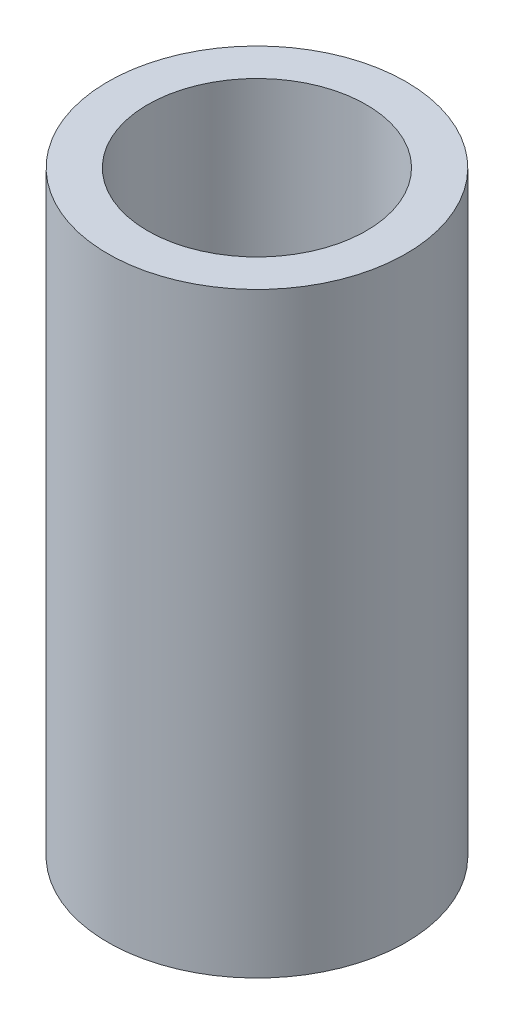
ISO-10303-21;
HEADER;
FILE_DESCRIPTION(('STEP AP214'),'2;1');
FILE_NAME('part.step','',(''),(''),'','','');
FILE_SCHEMA(('AUTOMOTIVE_DESIGN { 1 0 10303 214 1 1 1 1 }'));
ENDSEC;
DATA;
#1=APPLICATION_CONTEXT('core data for automotive mechanical design processes');
#2=APPLICATION_PROTOCOL_DEFINITION('international standard','automotive_design',2000,#1);
#3=PRODUCT_CONTEXT('',#1,'mechanical');
#4=PRODUCT('Part','Part','',(#3));
#5=PRODUCT_RELATED_PRODUCT_CATEGORY('part','',(#4));
#6=PRODUCT_DEFINITION_FORMATION('','',#4);
#7=PRODUCT_DEFINITION_CONTEXT('part definition',#1,'design');
#8=PRODUCT_DEFINITION('design','',#6,#7);
#9=PRODUCT_DEFINITION_SHAPE('','',#8);
#10=(LENGTH_UNIT() NAMED_UNIT(*) SI_UNIT(.MILLI.,.METRE.));
#11=(NAMED_UNIT(*) PLANE_ANGLE_UNIT() SI_UNIT($,.RADIAN.));
#12=(NAMED_UNIT(*) SI_UNIT($,.STERADIAN.) SOLID_ANGLE_UNIT());
#13=UNCERTAINTY_MEASURE_WITH_UNIT(LENGTH_MEASURE(1.E-05),#10,'distance_accuracy_value','');
#14=(GEOMETRIC_REPRESENTATION_CONTEXT(3) GLOBAL_UNCERTAINTY_ASSIGNED_CONTEXT((#13)) GLOBAL_UNIT_ASSIGNED_CONTEXT((#10,
#11,#12)) REPRESENTATION_CONTEXT('',''));
#15=CARTESIAN_POINT('',(0.,0.,0.));
#16=DIRECTION('',(0.,0.,1.));
#17=DIRECTION('',(1.,0.,0.));
#18=AXIS2_PLACEMENT_3D('',#15,#16,#17);
#19=CARTESIAN_POINT('',(0.,38.1,0.));
#20=DIRECTION('',(0.,-1.,0.));
#21=DIRECTION('',(0.,0.,-1.));
#22=AXIS2_PLACEMENT_3D('',#19,#20,#21);
#23=CYLINDRICAL_SURFACE('',#22,9.525);
#24=CARTESIAN_POINT('',(0.,38.1,0.));
#25=DIRECTION('',(0.,1.,0.));
#26=DIRECTION('',(0.,0.,1.));
#27=AXIS2_PLACEMENT_3D('',#24,#25,#26);
#28=CIRCLE('',#27,9.525);
#29=CARTESIAN_POINT('',(0.,38.1,-9.525));
#30=VERTEX_POINT('',#29);
#31=EDGE_CURVE('E10',#30,#30,#28,.T.);
#32=CARTESIAN_POINT('',(0.,0.,0.));
#33=DIRECTION('',(0.,1.,0.));
#34=DIRECTION('',(0.,0.,1.));
#35=AXIS2_PLACEMENT_3D('',#32,#33,#34);
#36=CIRCLE('',#35,9.525);
#37=CARTESIAN_POINT('',(0.,0.,-9.525));
#38=VERTEX_POINT('',#37);
#39=EDGE_CURVE('E36',#38,#38,#36,.T.);
#40=CARTESIAN_POINT('',(0.,38.1,-9.525));
#41=CARTESIAN_POINT('',(0.,37.703125,-9.525));
#42=CARTESIAN_POINT('',(0.,37.30625,-9.525));
#43=CARTESIAN_POINT('',(0.,36.5125,-9.525));
#44=CARTESIAN_POINT('',(0.,36.115625,-9.525));
#45=CARTESIAN_POINT('',(0.,35.321875,-9.525));
#46=CARTESIAN_POINT('',(0.,34.925,-9.525));
#47=CARTESIAN_POINT('',(0.,34.13125,-9.525));
#48=CARTESIAN_POINT('',(0.,33.734375,-9.525));
#49=CARTESIAN_POINT('',(0.,32.940625,-9.525));
#50=CARTESIAN_POINT('',(0.,32.54375,-9.525));
#51=CARTESIAN_POINT('',(0.,31.75,-9.525));
#52=CARTESIAN_POINT('',(0.,31.353125,-9.525));
#53=CARTESIAN_POINT('',(0.,30.559375,-9.525));
#54=CARTESIAN_POINT('',(0.,30.1625,-9.525));
#55=CARTESIAN_POINT('',(0.,29.36875,-9.525));
#56=CARTESIAN_POINT('',(0.,28.971875,-9.525));
#57=CARTESIAN_POINT('',(0.,28.178125,-9.525));
#58=CARTESIAN_POINT('',(0.,27.78125,-9.525));
#59=CARTESIAN_POINT('',(0.,26.9875,-9.525));
#60=CARTESIAN_POINT('',(0.,26.590625,-9.525));
#61=CARTESIAN_POINT('',(0.,25.796875,-9.525));
#62=CARTESIAN_POINT('',(0.,25.4,-9.525));
#63=CARTESIAN_POINT('',(0.,24.60625,-9.525));
#64=CARTESIAN_POINT('',(0.,24.209375,-9.525));
#65=CARTESIAN_POINT('',(0.,23.415625,-9.525));
#66=CARTESIAN_POINT('',(0.,23.01875,-9.525));
#67=CARTESIAN_POINT('',(0.,22.225,-9.525));
#68=CARTESIAN_POINT('',(0.,21.828125,-9.525));
#69=CARTESIAN_POINT('',(0.,21.034375,-9.525));
#70=CARTESIAN_POINT('',(0.,20.6375,-9.525));
#71=CARTESIAN_POINT('',(0.,19.84375,-9.525));
#72=CARTESIAN_POINT('',(0.,19.446875,-9.525));
#73=CARTESIAN_POINT('',(0.,18.653125,-9.525));
#74=CARTESIAN_POINT('',(0.,18.25625,-9.525));
#75=CARTESIAN_POINT('',(0.,17.4625,-9.525));
#76=CARTESIAN_POINT('',(0.,17.065625,-9.525));
#77=CARTESIAN_POINT('',(0.,16.271875,-9.525));
#78=CARTESIAN_POINT('',(0.,15.875,-9.525));
#79=CARTESIAN_POINT('',(0.,15.08125,-9.525));
#80=CARTESIAN_POINT('',(0.,14.684375,-9.525));
#81=CARTESIAN_POINT('',(0.,13.890625,-9.525));
#82=CARTESIAN_POINT('',(0.,13.49375,-9.525));
#83=CARTESIAN_POINT('',(0.,12.7,-9.525));
#84=CARTESIAN_POINT('',(0.,12.303125,-9.525));
#85=CARTESIAN_POINT('',(0.,11.509375,-9.525));
#86=CARTESIAN_POINT('',(0.,11.1125,-9.525));
#87=CARTESIAN_POINT('',(0.,10.31875,-9.525));
#88=CARTESIAN_POINT('',(0.,9.92187499999999,-9.525));
#89=CARTESIAN_POINT('',(0.,9.128125,-9.525));
#90=CARTESIAN_POINT('',(0.,8.73124999999999,-9.525));
#91=CARTESIAN_POINT('',(0.,7.93749999999999,-9.525));
#92=CARTESIAN_POINT('',(0.,7.54062499999999,-9.525));
#93=CARTESIAN_POINT('',(0.,6.746875,-9.525));
#94=CARTESIAN_POINT('',(0.,6.35,-9.525));
#95=CARTESIAN_POINT('',(0.,5.55625,-9.525));
#96=CARTESIAN_POINT('',(0.,5.159375,-9.525));
#97=CARTESIAN_POINT('',(0.,4.365625,-9.525));
#98=CARTESIAN_POINT('',(0.,3.96875,-9.525));
#99=CARTESIAN_POINT('',(0.,3.175,-9.525));
#100=CARTESIAN_POINT('',(0.,2.778125,-9.525));
#101=CARTESIAN_POINT('',(0.,1.984375,-9.525));
#102=CARTESIAN_POINT('',(0.,1.5875,-9.525));
#103=CARTESIAN_POINT('',(0.,0.79375,-9.525));
#104=CARTESIAN_POINT('',(0.,0.396875,-9.525));
#105=CARTESIAN_POINT('',(0.,0.,-9.525));
#106=B_SPLINE_CURVE_WITH_KNOTS('',3,(#40,#41,#42,#43,#44,#45,#46,#47,#48,#49,#50,#51,#52,#53,
#54,#55,#56,#57,#58,#59,#60,#61,#62,#63,#64,#65,#66,#67,#68,#69,#70,#71,#72,#73,#74,#75,#76,#77,
#78,#79,#80,#81,#82,#83,#84,#85,#86,#87,#88,#89,#90,#91,#92,#93,#94,#95,#96,#97,#98,#99,#100,
#101,#102,#103,#104,#105),.UNSPECIFIED.,.F.,.F.,(4,2,2,2,2,2,2,2,2,2,2,2,2,2,2,2,2,2,2,2,2,2,2,
2,2,2,2,2,2,2,2,2,4),(0.,1.190625,2.38125,3.571875,4.7625,5.953125,7.14375,8.334375,
9.52500000000001,10.715625,11.90625,13.096875,14.2875,15.478125,16.66875,17.859375,19.05,
20.240625,21.43125,22.621875,23.8125,25.003125,26.19375,27.384375,28.575,29.765625,30.95625,
32.146875,33.3375,34.528125,35.71875,36.909375,38.1),.UNSPECIFIED.);
#107=EDGE_CURVE('BSEAM33',#30,#38,#106,.T.);
#108=ORIENTED_EDGE('',*,*,#31,.F.);
#109=ORIENTED_EDGE('',*,*,#39,.T.);
#110=ORIENTED_EDGE('',*,*,#107,.T.);
#111=ORIENTED_EDGE('',*,*,#107,.F.);
#112=EDGE_LOOP('',(#108,#110,#109,#111));
#113=FACE_BOUND('',#112,.T.);
#114=ADVANCED_FACE('F33',(#113),#23,.T.);
#115=CARTESIAN_POINT('',(0.,38.1,0.));
#116=DIRECTION('',(0.,1.,0.));
#117=DIRECTION('',(0.,0.,1.));
#118=AXIS2_PLACEMENT_3D('',#115,#116,#117);
#119=PLANE('',#118);
#120=CARTESIAN_POINT('',(0.,38.1,0.));
#121=DIRECTION('',(0.,1.,0.));
#122=DIRECTION('',(0.,0.,1.));
#123=AXIS2_PLACEMENT_3D('',#120,#121,#122);
#124=CIRCLE('',#123,6.985);
#125=CARTESIAN_POINT('',(0.,38.1,6.985));
#126=VERTEX_POINT('',#125);
#127=EDGE_CURVE('E45',#126,#126,#124,.T.);
#128=ORIENTED_EDGE('',*,*,#127,.F.);
#129=EDGE_LOOP('',(#128));
#130=FACE_BOUND('',#129,.T.);
#131=ORIENTED_EDGE('',*,*,#31,.T.);
#132=EDGE_LOOP('',(#131));
#133=FACE_BOUND('',#132,.T.);
#134=ADVANCED_FACE('F60',(#130,#133),#119,.T.);
#135=CARTESIAN_POINT('',(0.,0.,0.));
#136=DIRECTION('',(0.,1.,0.));
#137=DIRECTION('',(0.,0.,1.));
#138=AXIS2_PLACEMENT_3D('',#135,#136,#137);
#139=PLANE('',#138);
#140=ORIENTED_EDGE('',*,*,#39,.F.);
#141=EDGE_LOOP('',(#140));
#142=FACE_BOUND('',#141,.T.);
#143=ADVANCED_FACE('F56',(#142),#139,.F.);
#144=CARTESIAN_POINT('',(0.,1.27000000000001,0.));
#145=DIRECTION('',(0.,1.,0.));
#146=DIRECTION('',(0.,0.,1.));
#147=AXIS2_PLACEMENT_3D('',#144,#145,#146);
#148=CYLINDRICAL_SURFACE('',#147,6.985);
#149=CARTESIAN_POINT('',(0.,1.27000000000001,0.));
#150=DIRECTION('',(0.,1.,0.));
#151=DIRECTION('',(0.,0.,1.));
#152=AXIS2_PLACEMENT_3D('',#149,#150,#151);
#153=CIRCLE('',#152,6.985);
#154=CARTESIAN_POINT('',(0.,1.27000000000001,6.985));
#155=VERTEX_POINT('',#154);
#156=EDGE_CURVE('E43',#155,#155,#153,.T.);
#157=ORIENTED_EDGE('',*,*,#156,.F.);
#158=EDGE_LOOP('',(#157));
#159=FACE_BOUND('',#158,.T.);
#160=ORIENTED_EDGE('',*,*,#127,.T.);
#161=EDGE_LOOP('',(#160));
#162=FACE_BOUND('',#161,.T.);
#163=ADVANCED_FACE('F53',(#159,#162),#148,.F.);
#164=CARTESIAN_POINT('',(0.,1.27000000000001,0.));
#165=DIRECTION('',(0.,1.,0.));
#166=DIRECTION('',(0.,0.,1.));
#167=AXIS2_PLACEMENT_3D('',#164,#165,#166);
#168=PLANE('',#167);
#169=ORIENTED_EDGE('',*,*,#156,.T.);
#170=EDGE_LOOP('',(#169));
#171=FACE_BOUND('',#170,.T.);
#172=ADVANCED_FACE('F51',(#171),#168,.T.);
#173=CLOSED_SHELL('',(#114,#134,#143,#163,#172));
#174=MANIFOLD_SOLID_BREP('B2',#173);
#175=ADVANCED_BREP_SHAPE_REPRESENTATION('',(#18,#174),#14);
#176=SHAPE_DEFINITION_REPRESENTATION(#9,#175);
ENDSEC;
END-ISO-10303-21;
